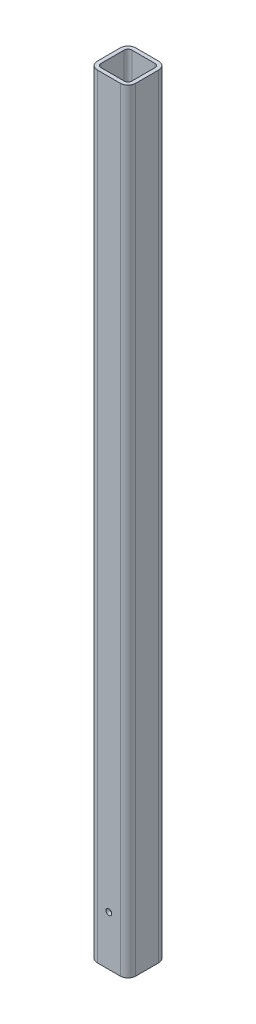
ISO-10303-21;
HEADER;
FILE_DESCRIPTION(('STEP AP214'),'2;1');
FILE_NAME('part.step','',(''),(''),'','','');
FILE_SCHEMA(('AUTOMOTIVE_DESIGN { 1 0 10303 214 1 1 1 1 }'));
ENDSEC;
DATA;
#1=APPLICATION_CONTEXT('core data for automotive mechanical design processes');
#2=APPLICATION_PROTOCOL_DEFINITION('international standard','automotive_design',2000,#1);
#3=PRODUCT_CONTEXT('',#1,'mechanical');
#4=PRODUCT('Part','Part','',(#3));
#5=PRODUCT_RELATED_PRODUCT_CATEGORY('part','',(#4));
#6=PRODUCT_DEFINITION_FORMATION('','',#4);
#7=PRODUCT_DEFINITION_CONTEXT('part definition',#1,'design');
#8=PRODUCT_DEFINITION('design','',#6,#7);
#9=PRODUCT_DEFINITION_SHAPE('','',#8);
#10=(LENGTH_UNIT() NAMED_UNIT(*) SI_UNIT(.MILLI.,.METRE.));
#11=(NAMED_UNIT(*) PLANE_ANGLE_UNIT() SI_UNIT($,.RADIAN.));
#12=(NAMED_UNIT(*) SI_UNIT($,.STERADIAN.) SOLID_ANGLE_UNIT());
#13=UNCERTAINTY_MEASURE_WITH_UNIT(LENGTH_MEASURE(1.E-05),#10,'distance_accuracy_value','');
#14=(GEOMETRIC_REPRESENTATION_CONTEXT(3) GLOBAL_UNCERTAINTY_ASSIGNED_CONTEXT((#13)) GLOBAL_UNIT_ASSIGNED_CONTEXT((#10,
#11,#12)) REPRESENTATION_CONTEXT('',''));
#15=CARTESIAN_POINT('',(0.,0.,0.));
#16=DIRECTION('',(0.,0.,1.));
#17=DIRECTION('',(1.,0.,0.));
#18=AXIS2_PLACEMENT_3D('',#15,#16,#17);
#19=CARTESIAN_POINT('',(-12.,1866.99975786051,12.));
#20=DIRECTION('',(0.,-1.,0.));
#21=DIRECTION('',(0.,0.,-1.));
#22=AXIS2_PLACEMENT_3D('',#19,#20,#21);
#23=CYLINDRICAL_SURFACE('',#22,8.);
#24=CARTESIAN_POINT('',(-12.,1060.7613706876,12.));
#25=DIRECTION('',(0.,1.,0.));
#26=DIRECTION('',(0.,0.,1.));
#27=AXIS2_PLACEMENT_3D('',#24,#25,#26);
#28=CIRCLE('',#27,8.);
#29=CARTESIAN_POINT('',(-20.,1060.7613706876,12.));
#30=VERTEX_POINT('',#29);
#31=CARTESIAN_POINT('',(-12.,1060.7613706876,20.));
#32=VERTEX_POINT('',#31);
#33=EDGE_CURVE('E234',#30,#32,#28,.T.);
#34=ORIENTED_EDGE('',*,*,#33,.T.);
#35=DIRECTION('',(0.,-1.,0.));
#36=VECTOR('',#35,1.);
#37=CARTESIAN_POINT('',(-12.,1866.99975786051,20.));
#38=LINE('',#37,#36);
#39=CARTESIAN_POINT('',(-12.,1866.99975786051,20.));
#40=VERTEX_POINT('',#39);
#41=EDGE_CURVE('E12',#40,#32,#38,.T.);
#42=ORIENTED_EDGE('',*,*,#41,.F.);
#43=CARTESIAN_POINT('',(-12.,1866.99975786051,12.));
#44=DIRECTION('',(0.,1.,0.));
#45=DIRECTION('',(0.,0.,1.));
#46=AXIS2_PLACEMENT_3D('',#43,#44,#45);
#47=CIRCLE('',#46,8.);
#48=CARTESIAN_POINT('',(-20.,1866.99975786051,12.));
#49=VERTEX_POINT('',#48);
#50=EDGE_CURVE('E313',#49,#40,#47,.T.);
#51=ORIENTED_EDGE('',*,*,#50,.F.);
#52=DIRECTION('',(0.,-1.,0.));
#53=VECTOR('',#52,1.);
#54=CARTESIAN_POINT('',(-20.,1866.99975786051,12.));
#55=LINE('',#54,#53);
#56=EDGE_CURVE('E249',#49,#30,#55,.T.);
#57=ORIENTED_EDGE('',*,*,#56,.T.);
#58=EDGE_LOOP('',(#34,#42,#51,#57));
#59=FACE_BOUND('',#58,.T.);
#60=ADVANCED_FACE('F60',(#59),#23,.T.);
#61=CARTESIAN_POINT('',(-12.,1866.99975786051,20.));
#62=DIRECTION('',(0.,0.,-1.));
#63=DIRECTION('',(-1.,0.,0.));
#64=AXIS2_PLACEMENT_3D('',#61,#62,#63);
#65=PLANE('',#64);
#66=CARTESIAN_POINT('',(0.,1112.60405955793,20.));
#67=DIRECTION('',(0.,0.,-1.));
#68=DIRECTION('',(-1.,0.,0.));
#69=AXIS2_PLACEMENT_3D('',#66,#67,#68);
#70=CIRCLE('',#69,3.);
#71=CARTESIAN_POINT('',(-3.,1112.60405955793,20.));
#72=VERTEX_POINT('',#71);
#73=EDGE_CURVE('E213',#72,#72,#70,.T.);
#74=ORIENTED_EDGE('',*,*,#73,.T.);
#75=EDGE_LOOP('',(#74));
#76=FACE_BOUND('',#75,.T.);
#77=DIRECTION('',(1.,0.,0.));
#78=VECTOR('',#77,1.);
#79=CARTESIAN_POINT('',(-12.,1060.7613706876,20.));
#80=LINE('',#79,#78);
#81=CARTESIAN_POINT('',(12.,1060.7613706876,20.));
#82=VERTEX_POINT('',#81);
#83=EDGE_CURVE('E237',#32,#82,#80,.T.);
#84=ORIENTED_EDGE('',*,*,#83,.T.);
#85=DIRECTION('',(0.,-1.,0.));
#86=VECTOR('',#85,1.);
#87=CARTESIAN_POINT('',(12.,1866.99975786051,20.));
#88=LINE('',#87,#86);
#89=CARTESIAN_POINT('',(12.,1866.99975786051,20.));
#90=VERTEX_POINT('',#89);
#91=EDGE_CURVE('E70',#90,#82,#88,.T.);
#92=ORIENTED_EDGE('',*,*,#91,.F.);
#93=DIRECTION('',(1.,0.,0.));
#94=VECTOR('',#93,1.);
#95=CARTESIAN_POINT('',(-12.,1866.99975786051,20.));
#96=LINE('',#95,#94);
#97=EDGE_CURVE('E315',#40,#90,#96,.T.);
#98=ORIENTED_EDGE('',*,*,#97,.F.);
#99=ORIENTED_EDGE('',*,*,#41,.T.);
#100=EDGE_LOOP('',(#84,#92,#98,#99));
#101=FACE_BOUND('',#100,.T.);
#102=ADVANCED_FACE('F350',(#76,#101),#65,.F.);
#103=CARTESIAN_POINT('',(12.,1866.99975786051,12.));
#104=DIRECTION('',(0.,-1.,0.));
#105=DIRECTION('',(0.,0.,-1.));
#106=AXIS2_PLACEMENT_3D('',#103,#104,#105);
#107=CYLINDRICAL_SURFACE('',#106,8.);
#108=CARTESIAN_POINT('',(12.,1060.7613706876,12.));
#109=DIRECTION('',(0.,1.,0.));
#110=DIRECTION('',(0.,0.,1.));
#111=AXIS2_PLACEMENT_3D('',#108,#109,#110);
#112=CIRCLE('',#111,8.);
#113=CARTESIAN_POINT('',(20.,1060.7613706876,12.));
#114=VERTEX_POINT('',#113);
#115=EDGE_CURVE('E239',#82,#114,#112,.T.);
#116=ORIENTED_EDGE('',*,*,#115,.T.);
#117=DIRECTION('',(0.,-1.,0.));
#118=VECTOR('',#117,1.);
#119=CARTESIAN_POINT('',(20.,1866.99975786051,12.));
#120=LINE('',#119,#118);
#121=CARTESIAN_POINT('',(20.,1866.99975786051,12.));
#122=VERTEX_POINT('',#121);
#123=EDGE_CURVE('E256',#122,#114,#120,.T.);
#124=ORIENTED_EDGE('',*,*,#123,.F.);
#125=CARTESIAN_POINT('',(12.,1866.99975786051,12.));
#126=DIRECTION('',(0.,1.,0.));
#127=DIRECTION('',(0.,0.,1.));
#128=AXIS2_PLACEMENT_3D('',#125,#126,#127);
#129=CIRCLE('',#128,8.);
#130=EDGE_CURVE('E317',#90,#122,#129,.T.);
#131=ORIENTED_EDGE('',*,*,#130,.F.);
#132=ORIENTED_EDGE('',*,*,#91,.T.);
#133=EDGE_LOOP('',(#116,#124,#131,#132));
#134=FACE_BOUND('',#133,.T.);
#135=ADVANCED_FACE('F356',(#134),#107,.T.);
#136=CARTESIAN_POINT('',(20.,1866.99975786051,-12.));
#137=DIRECTION('',(-1.,0.,0.));
#138=DIRECTION('',(0.,0.,1.));
#139=AXIS2_PLACEMENT_3D('',#136,#137,#138);
#140=PLANE('',#139);
#141=DIRECTION('',(0.,0.,-1.));
#142=VECTOR('',#141,1.);
#143=CARTESIAN_POINT('',(20.,1060.7613706876,-12.));
#144=LINE('',#143,#142);
#145=CARTESIAN_POINT('',(20.,1060.7613706876,-12.));
#146=VERTEX_POINT('',#145);
#147=EDGE_CURVE('E241',#114,#146,#144,.T.);
#148=ORIENTED_EDGE('',*,*,#147,.T.);
#149=DIRECTION('',(0.,-1.,0.));
#150=VECTOR('',#149,1.);
#151=CARTESIAN_POINT('',(20.,1866.99975786051,-12.));
#152=LINE('',#151,#150);
#153=CARTESIAN_POINT('',(20.,1866.99975786051,-12.));
#154=VERTEX_POINT('',#153);
#155=EDGE_CURVE('E253',#154,#146,#152,.T.);
#156=ORIENTED_EDGE('',*,*,#155,.F.);
#157=DIRECTION('',(0.,0.,-1.));
#158=VECTOR('',#157,1.);
#159=CARTESIAN_POINT('',(20.,1866.99975786051,-12.));
#160=LINE('',#159,#158);
#161=EDGE_CURVE('E319',#122,#154,#160,.T.);
#162=ORIENTED_EDGE('',*,*,#161,.F.);
#163=ORIENTED_EDGE('',*,*,#123,.T.);
#164=EDGE_LOOP('',(#148,#156,#162,#163));
#165=FACE_BOUND('',#164,.T.);
#166=ADVANCED_FACE('F325',(#165),#140,.F.);
#167=CARTESIAN_POINT('',(12.,1866.99975786051,-12.));
#168=DIRECTION('',(0.,-1.,0.));
#169=DIRECTION('',(0.,0.,-1.));
#170=AXIS2_PLACEMENT_3D('',#167,#168,#169);
#171=CYLINDRICAL_SURFACE('',#170,8.);
#172=CARTESIAN_POINT('',(12.,1060.7613706876,-12.));
#173=DIRECTION('',(0.,1.,0.));
#174=DIRECTION('',(0.,0.,1.));
#175=AXIS2_PLACEMENT_3D('',#172,#173,#174);
#176=CIRCLE('',#175,8.);
#177=CARTESIAN_POINT('',(12.,1060.7613706876,-20.));
#178=VERTEX_POINT('',#177);
#179=EDGE_CURVE('E243',#146,#178,#176,.T.);
#180=ORIENTED_EDGE('',*,*,#179,.T.);
#181=DIRECTION('',(0.,-1.,0.));
#182=VECTOR('',#181,1.);
#183=CARTESIAN_POINT('',(12.,1866.99975786051,-20.));
#184=LINE('',#183,#182);
#185=CARTESIAN_POINT('',(12.,1866.99975786051,-20.));
#186=VERTEX_POINT('',#185);
#187=EDGE_CURVE('E200',#186,#178,#184,.T.);
#188=ORIENTED_EDGE('',*,*,#187,.F.);
#189=CARTESIAN_POINT('',(12.,1866.99975786051,-12.));
#190=DIRECTION('',(0.,1.,0.));
#191=DIRECTION('',(0.,0.,1.));
#192=AXIS2_PLACEMENT_3D('',#189,#190,#191);
#193=CIRCLE('',#192,8.);
#194=EDGE_CURVE('E191',#154,#186,#193,.T.);
#195=ORIENTED_EDGE('',*,*,#194,.F.);
#196=ORIENTED_EDGE('',*,*,#155,.T.);
#197=EDGE_LOOP('',(#180,#188,#195,#196));
#198=FACE_BOUND('',#197,.T.);
#199=ADVANCED_FACE('F329',(#198),#171,.T.);
#200=CARTESIAN_POINT('',(12.,1866.99975786051,-20.));
#201=DIRECTION('',(0.,0.,1.));
#202=DIRECTION('',(1.,0.,0.));
#203=AXIS2_PLACEMENT_3D('',#200,#201,#202);
#204=PLANE('',#203);
#205=CARTESIAN_POINT('',(0.,1112.60405955793,-20.));
#206=DIRECTION('',(0.,0.,-1.));
#207=DIRECTION('',(-1.,0.,0.));
#208=AXIS2_PLACEMENT_3D('',#205,#206,#207);
#209=CIRCLE('',#208,3.);
#210=CARTESIAN_POINT('',(-3.,1112.60405955793,-20.));
#211=VERTEX_POINT('',#210);
#212=EDGE_CURVE('E390',#211,#211,#209,.T.);
#213=ORIENTED_EDGE('',*,*,#212,.F.);
#214=EDGE_LOOP('',(#213));
#215=FACE_BOUND('',#214,.T.);
#216=DIRECTION('',(-1.,0.,0.));
#217=VECTOR('',#216,1.);
#218=CARTESIAN_POINT('',(12.,1060.7613706876,-20.));
#219=LINE('',#218,#217);
#220=CARTESIAN_POINT('',(-12.,1060.7613706876,-20.));
#221=VERTEX_POINT('',#220);
#222=EDGE_CURVE('E199',#178,#221,#219,.T.);
#223=ORIENTED_EDGE('',*,*,#222,.T.);
#224=DIRECTION('',(0.,-1.,0.));
#225=VECTOR('',#224,1.);
#226=CARTESIAN_POINT('',(-12.,1866.99975786051,-20.));
#227=LINE('',#226,#225);
#228=CARTESIAN_POINT('',(-12.,1866.99975786051,-20.));
#229=VERTEX_POINT('',#228);
#230=EDGE_CURVE('E196',#229,#221,#227,.T.);
#231=ORIENTED_EDGE('',*,*,#230,.F.);
#232=DIRECTION('',(-1.,0.,0.));
#233=VECTOR('',#232,1.);
#234=CARTESIAN_POINT('',(12.,1866.99975786051,-20.));
#235=LINE('',#234,#233);
#236=EDGE_CURVE('E185',#186,#229,#235,.T.);
#237=ORIENTED_EDGE('',*,*,#236,.F.);
#238=ORIENTED_EDGE('',*,*,#187,.T.);
#239=EDGE_LOOP('',(#223,#231,#237,#238));
#240=FACE_BOUND('',#239,.T.);
#241=ADVANCED_FACE('F197',(#215,#240),#204,.F.);
#242=CARTESIAN_POINT('',(-12.,1866.99975786051,-12.));
#243=DIRECTION('',(0.,-1.,0.));
#244=DIRECTION('',(0.,0.,-1.));
#245=AXIS2_PLACEMENT_3D('',#242,#243,#244);
#246=CYLINDRICAL_SURFACE('',#245,8.);
#247=CARTESIAN_POINT('',(-12.,1060.7613706876,-12.));
#248=DIRECTION('',(0.,1.,0.));
#249=DIRECTION('',(0.,0.,1.));
#250=AXIS2_PLACEMENT_3D('',#247,#248,#249);
#251=CIRCLE('',#250,8.);
#252=CARTESIAN_POINT('',(-20.,1060.7613706876,-12.));
#253=VERTEX_POINT('',#252);
#254=EDGE_CURVE('E132',#221,#253,#251,.T.);
#255=ORIENTED_EDGE('',*,*,#254,.T.);
#256=DIRECTION('',(0.,-1.,0.));
#257=VECTOR('',#256,1.);
#258=CARTESIAN_POINT('',(-20.,1866.99975786051,-12.));
#259=LINE('',#258,#257);
#260=CARTESIAN_POINT('',(-20.,1866.99975786051,-12.));
#261=VERTEX_POINT('',#260);
#262=EDGE_CURVE('E201',#261,#253,#259,.T.);
#263=ORIENTED_EDGE('',*,*,#262,.F.);
#264=CARTESIAN_POINT('',(-12.,1866.99975786051,-12.));
#265=DIRECTION('',(0.,1.,0.));
#266=DIRECTION('',(0.,0.,1.));
#267=AXIS2_PLACEMENT_3D('',#264,#265,#266);
#268=CIRCLE('',#267,8.);
#269=EDGE_CURVE('E189',#229,#261,#268,.T.);
#270=ORIENTED_EDGE('',*,*,#269,.F.);
#271=ORIENTED_EDGE('',*,*,#230,.T.);
#272=EDGE_LOOP('',(#255,#263,#270,#271));
#273=FACE_BOUND('',#272,.T.);
#274=ADVANCED_FACE('F203',(#273),#246,.T.);
#275=CARTESIAN_POINT('',(12.,1866.99975786051,12.));
#276=DIRECTION('',(0.,-1.,0.));
#277=DIRECTION('',(0.,0.,-1.));
#278=AXIS2_PLACEMENT_3D('',#275,#276,#277);
#279=CYLINDRICAL_SURFACE('',#278,4.);
#280=CARTESIAN_POINT('',(12.,1060.7613706876,12.));
#281=DIRECTION('',(0.,1.,0.));
#282=DIRECTION('',(0.,0.,1.));
#283=AXIS2_PLACEMENT_3D('',#280,#281,#282);
#284=CIRCLE('',#283,4.);
#285=CARTESIAN_POINT('',(12.,1060.7613706876,16.));
#286=VERTEX_POINT('',#285);
#287=CARTESIAN_POINT('',(16.,1060.7613706876,12.));
#288=VERTEX_POINT('',#287);
#289=EDGE_CURVE('E209',#286,#288,#284,.T.);
#290=ORIENTED_EDGE('',*,*,#289,.F.);
#291=DIRECTION('',(0.,-1.,0.));
#292=VECTOR('',#291,1.);
#293=CARTESIAN_POINT('',(12.,1866.99975786051,16.));
#294=LINE('',#293,#292);
#295=CARTESIAN_POINT('',(12.,1866.99975786051,16.));
#296=VERTEX_POINT('',#295);
#297=EDGE_CURVE('E146',#296,#286,#294,.T.);
#298=ORIENTED_EDGE('',*,*,#297,.F.);
#299=CARTESIAN_POINT('',(12.,1866.99975786051,12.));
#300=DIRECTION('',(0.,1.,0.));
#301=DIRECTION('',(0.,0.,1.));
#302=AXIS2_PLACEMENT_3D('',#299,#300,#301);
#303=CIRCLE('',#302,4.);
#304=CARTESIAN_POINT('',(16.,1866.99975786051,12.));
#305=VERTEX_POINT('',#304);
#306=EDGE_CURVE('E248',#296,#305,#303,.T.);
#307=ORIENTED_EDGE('',*,*,#306,.T.);
#308=DIRECTION('',(0.,-1.,0.));
#309=VECTOR('',#308,1.);
#310=CARTESIAN_POINT('',(16.,1866.99975786051,12.));
#311=LINE('',#310,#309);
#312=EDGE_CURVE('E205',#305,#288,#311,.T.);
#313=ORIENTED_EDGE('',*,*,#312,.T.);
#314=EDGE_LOOP('',(#290,#298,#307,#313));
#315=FACE_BOUND('',#314,.T.);
#316=ADVANCED_FACE('F62',(#315),#279,.F.);
#317=CARTESIAN_POINT('',(-12.,1866.99975786051,16.));
#318=DIRECTION('',(0.,0.,-1.));
#319=DIRECTION('',(-1.,0.,0.));
#320=AXIS2_PLACEMENT_3D('',#317,#318,#319);
#321=PLANE('',#320);
#322=CARTESIAN_POINT('',(0.,1112.60405955793,16.));
#323=DIRECTION('',(0.,0.,-1.));
#324=DIRECTION('',(-1.,0.,0.));
#325=AXIS2_PLACEMENT_3D('',#322,#323,#324);
#326=CIRCLE('',#325,3.);
#327=CARTESIAN_POINT('',(-3.,1112.60405955793,16.));
#328=VERTEX_POINT('',#327);
#329=EDGE_CURVE('E385',#328,#328,#326,.T.);
#330=ORIENTED_EDGE('',*,*,#329,.F.);
#331=EDGE_LOOP('',(#330));
#332=FACE_BOUND('',#331,.T.);
#333=DIRECTION('',(1.,0.,0.));
#334=VECTOR('',#333,1.);
#335=CARTESIAN_POINT('',(-12.,1060.7613706876,16.));
#336=LINE('',#335,#334);
#337=CARTESIAN_POINT('',(-12.,1060.7613706876,16.));
#338=VERTEX_POINT('',#337);
#339=EDGE_CURVE('E212',#338,#286,#336,.T.);
#340=ORIENTED_EDGE('',*,*,#339,.F.);
#341=DIRECTION('',(0.,-1.,0.));
#342=VECTOR('',#341,1.);
#343=CARTESIAN_POINT('',(-12.,1866.99975786051,16.));
#344=LINE('',#343,#342);
#345=CARTESIAN_POINT('',(-12.,1866.99975786051,16.));
#346=VERTEX_POINT('',#345);
#347=EDGE_CURVE('E272',#346,#338,#344,.T.);
#348=ORIENTED_EDGE('',*,*,#347,.F.);
#349=DIRECTION('',(1.,0.,0.));
#350=VECTOR('',#349,1.);
#351=CARTESIAN_POINT('',(-12.,1866.99975786051,16.));
#352=LINE('',#351,#350);
#353=EDGE_CURVE('E278',#346,#296,#352,.T.);
#354=ORIENTED_EDGE('',*,*,#353,.T.);
#355=ORIENTED_EDGE('',*,*,#297,.T.);
#356=EDGE_LOOP('',(#340,#348,#354,#355));
#357=FACE_BOUND('',#356,.T.);
#358=ADVANCED_FACE('F276',(#332,#357),#321,.T.);
#359=CARTESIAN_POINT('',(-12.,1866.99975786051,12.));
#360=DIRECTION('',(0.,-1.,0.));
#361=DIRECTION('',(0.,0.,-1.));
#362=AXIS2_PLACEMENT_3D('',#359,#360,#361);
#363=CYLINDRICAL_SURFACE('',#362,4.);
#364=CARTESIAN_POINT('',(-12.,1060.7613706876,12.));
#365=DIRECTION('',(0.,1.,0.));
#366=DIRECTION('',(0.,0.,1.));
#367=AXIS2_PLACEMENT_3D('',#364,#365,#366);
#368=CIRCLE('',#367,4.);
#369=CARTESIAN_POINT('',(-16.,1060.7613706876,12.));
#370=VERTEX_POINT('',#369);
#371=EDGE_CURVE('E216',#370,#338,#368,.T.);
#372=ORIENTED_EDGE('',*,*,#371,.F.);
#373=DIRECTION('',(0.,-1.,0.));
#374=VECTOR('',#373,1.);
#375=CARTESIAN_POINT('',(-16.,1866.99975786051,12.));
#376=LINE('',#375,#374);
#377=CARTESIAN_POINT('',(-16.,1866.99975786051,12.));
#378=VERTEX_POINT('',#377);
#379=EDGE_CURVE('E270',#378,#370,#376,.T.);
#380=ORIENTED_EDGE('',*,*,#379,.F.);
#381=CARTESIAN_POINT('',(-12.,1866.99975786051,12.));
#382=DIRECTION('',(0.,1.,0.));
#383=DIRECTION('',(0.,0.,1.));
#384=AXIS2_PLACEMENT_3D('',#381,#382,#383);
#385=CIRCLE('',#384,4.);
#386=EDGE_CURVE('E289',#378,#346,#385,.T.);
#387=ORIENTED_EDGE('',*,*,#386,.T.);
#388=ORIENTED_EDGE('',*,*,#347,.T.);
#389=EDGE_LOOP('',(#372,#380,#387,#388));
#390=FACE_BOUND('',#389,.T.);
#391=ADVANCED_FACE('F286',(#390),#363,.F.);
#392=CARTESIAN_POINT('',(-16.,1866.99975786051,12.));
#393=DIRECTION('',(1.,0.,0.));
#394=DIRECTION('',(0.,0.,-1.));
#395=AXIS2_PLACEMENT_3D('',#392,#393,#394);
#396=PLANE('',#395);
#397=DIRECTION('',(0.,0.,1.));
#398=VECTOR('',#397,1.);
#399=CARTESIAN_POINT('',(-16.,1060.7613706876,12.));
#400=LINE('',#399,#398);
#401=CARTESIAN_POINT('',(-16.,1060.7613706876,-12.));
#402=VERTEX_POINT('',#401);
#403=EDGE_CURVE('E219',#402,#370,#400,.T.);
#404=ORIENTED_EDGE('',*,*,#403,.F.);
#405=DIRECTION('',(0.,-1.,0.));
#406=VECTOR('',#405,1.);
#407=CARTESIAN_POINT('',(-16.,1866.99975786051,-12.));
#408=LINE('',#407,#406);
#409=CARTESIAN_POINT('',(-16.,1866.99975786051,-12.));
#410=VERTEX_POINT('',#409);
#411=EDGE_CURVE('E268',#410,#402,#408,.T.);
#412=ORIENTED_EDGE('',*,*,#411,.F.);
#413=DIRECTION('',(0.,0.,1.));
#414=VECTOR('',#413,1.);
#415=CARTESIAN_POINT('',(-16.,1866.99975786051,12.));
#416=LINE('',#415,#414);
#417=EDGE_CURVE('E295',#410,#378,#416,.T.);
#418=ORIENTED_EDGE('',*,*,#417,.T.);
#419=ORIENTED_EDGE('',*,*,#379,.T.);
#420=EDGE_LOOP('',(#404,#412,#418,#419));
#421=FACE_BOUND('',#420,.T.);
#422=ADVANCED_FACE('F371',(#421),#396,.T.);
#423=CARTESIAN_POINT('',(-12.,1866.99975786051,-12.));
#424=DIRECTION('',(0.,-1.,0.));
#425=DIRECTION('',(0.,0.,-1.));
#426=AXIS2_PLACEMENT_3D('',#423,#424,#425);
#427=CYLINDRICAL_SURFACE('',#426,4.);
#428=CARTESIAN_POINT('',(-12.,1060.7613706876,-12.));
#429=DIRECTION('',(0.,1.,0.));
#430=DIRECTION('',(0.,0.,1.));
#431=AXIS2_PLACEMENT_3D('',#428,#429,#430);
#432=CIRCLE('',#431,4.);
#433=CARTESIAN_POINT('',(-12.,1060.7613706876,-16.));
#434=VERTEX_POINT('',#433);
#435=EDGE_CURVE('E222',#434,#402,#432,.T.);
#436=ORIENTED_EDGE('',*,*,#435,.F.);
#437=DIRECTION('',(0.,-1.,0.));
#438=VECTOR('',#437,1.);
#439=CARTESIAN_POINT('',(-12.,1866.99975786051,-16.));
#440=LINE('',#439,#438);
#441=CARTESIAN_POINT('',(-12.,1866.99975786051,-16.));
#442=VERTEX_POINT('',#441);
#443=EDGE_CURVE('E266',#442,#434,#440,.T.);
#444=ORIENTED_EDGE('',*,*,#443,.F.);
#445=CARTESIAN_POINT('',(-12.,1866.99975786051,-12.));
#446=DIRECTION('',(0.,1.,0.));
#447=DIRECTION('',(0.,0.,1.));
#448=AXIS2_PLACEMENT_3D('',#445,#446,#447);
#449=CIRCLE('',#448,4.);
#450=EDGE_CURVE('E301',#442,#410,#449,.T.);
#451=ORIENTED_EDGE('',*,*,#450,.T.);
#452=ORIENTED_EDGE('',*,*,#411,.T.);
#453=EDGE_LOOP('',(#436,#444,#451,#452));
#454=FACE_BOUND('',#453,.T.);
#455=ADVANCED_FACE('F367',(#454),#427,.F.);
#456=CARTESIAN_POINT('',(12.,1866.99975786051,-16.));
#457=DIRECTION('',(0.,0.,1.));
#458=DIRECTION('',(1.,0.,0.));
#459=AXIS2_PLACEMENT_3D('',#456,#457,#458);
#460=PLANE('',#459);
#461=CARTESIAN_POINT('',(0.,1112.60405955793,-16.));
#462=DIRECTION('',(0.,0.,1.));
#463=DIRECTION('',(1.,0.,0.));
#464=AXIS2_PLACEMENT_3D('',#461,#462,#463);
#465=CIRCLE('',#464,3.);
#466=CARTESIAN_POINT('',(3.,1112.60405955793,-16.));
#467=VERTEX_POINT('',#466);
#468=EDGE_CURVE('E64',#467,#467,#465,.T.);
#469=ORIENTED_EDGE('',*,*,#468,.F.);
#470=EDGE_LOOP('',(#469));
#471=FACE_BOUND('',#470,.T.);
#472=DIRECTION('',(-1.,0.,0.));
#473=VECTOR('',#472,1.);
#474=CARTESIAN_POINT('',(12.,1060.7613706876,-16.));
#475=LINE('',#474,#473);
#476=CARTESIAN_POINT('',(12.,1060.7613706876,-16.));
#477=VERTEX_POINT('',#476);
#478=EDGE_CURVE('E225',#477,#434,#475,.T.);
#479=ORIENTED_EDGE('',*,*,#478,.F.);
#480=DIRECTION('',(0.,-1.,0.));
#481=VECTOR('',#480,1.);
#482=CARTESIAN_POINT('',(12.,1866.99975786051,-16.));
#483=LINE('',#482,#481);
#484=CARTESIAN_POINT('',(12.,1866.99975786051,-16.));
#485=VERTEX_POINT('',#484);
#486=EDGE_CURVE('E264',#485,#477,#483,.T.);
#487=ORIENTED_EDGE('',*,*,#486,.F.);
#488=DIRECTION('',(-1.,0.,0.));
#489=VECTOR('',#488,1.);
#490=CARTESIAN_POINT('',(12.,1866.99975786051,-16.));
#491=LINE('',#490,#489);
#492=EDGE_CURVE('E304',#485,#442,#491,.T.);
#493=ORIENTED_EDGE('',*,*,#492,.T.);
#494=ORIENTED_EDGE('',*,*,#443,.T.);
#495=EDGE_LOOP('',(#479,#487,#493,#494));
#496=FACE_BOUND('',#495,.T.);
#497=ADVANCED_FACE('F363',(#471,#496),#460,.T.);
#498=CARTESIAN_POINT('',(12.,1866.99975786051,-12.));
#499=DIRECTION('',(0.,-1.,0.));
#500=DIRECTION('',(0.,0.,-1.));
#501=AXIS2_PLACEMENT_3D('',#498,#499,#500);
#502=CYLINDRICAL_SURFACE('',#501,4.);
#503=CARTESIAN_POINT('',(12.,1060.7613706876,-12.));
#504=DIRECTION('',(0.,1.,0.));
#505=DIRECTION('',(0.,0.,1.));
#506=AXIS2_PLACEMENT_3D('',#503,#504,#505);
#507=CIRCLE('',#506,4.);
#508=CARTESIAN_POINT('',(16.,1060.7613706876,-12.));
#509=VERTEX_POINT('',#508);
#510=EDGE_CURVE('E228',#509,#477,#507,.T.);
#511=ORIENTED_EDGE('',*,*,#510,.F.);
#512=DIRECTION('',(0.,-1.,0.));
#513=VECTOR('',#512,1.);
#514=CARTESIAN_POINT('',(16.,1866.99975786051,-12.));
#515=LINE('',#514,#513);
#516=CARTESIAN_POINT('',(16.,1866.99975786051,-12.));
#517=VERTEX_POINT('',#516);
#518=EDGE_CURVE('E262',#517,#509,#515,.T.);
#519=ORIENTED_EDGE('',*,*,#518,.F.);
#520=CARTESIAN_POINT('',(12.,1866.99975786051,-12.));
#521=DIRECTION('',(0.,1.,0.));
#522=DIRECTION('',(0.,0.,1.));
#523=AXIS2_PLACEMENT_3D('',#520,#521,#522);
#524=CIRCLE('',#523,4.);
#525=EDGE_CURVE('E307',#517,#485,#524,.T.);
#526=ORIENTED_EDGE('',*,*,#525,.T.);
#527=ORIENTED_EDGE('',*,*,#486,.T.);
#528=EDGE_LOOP('',(#511,#519,#526,#527));
#529=FACE_BOUND('',#528,.T.);
#530=ADVANCED_FACE('F344',(#529),#502,.F.);
#531=CARTESIAN_POINT('',(16.,1866.99975786051,-12.));
#532=DIRECTION('',(-1.,0.,0.));
#533=DIRECTION('',(0.,0.,1.));
#534=AXIS2_PLACEMENT_3D('',#531,#532,#533);
#535=PLANE('',#534);
#536=DIRECTION('',(0.,0.,-1.));
#537=VECTOR('',#536,1.);
#538=CARTESIAN_POINT('',(16.,1060.7613706876,-12.));
#539=LINE('',#538,#537);
#540=EDGE_CURVE('E231',#288,#509,#539,.T.);
#541=ORIENTED_EDGE('',*,*,#540,.F.);
#542=ORIENTED_EDGE('',*,*,#312,.F.);
#543=DIRECTION('',(0.,0.,-1.));
#544=VECTOR('',#543,1.);
#545=CARTESIAN_POINT('',(16.,1866.99975786051,-12.));
#546=LINE('',#545,#544);
#547=EDGE_CURVE('E310',#305,#517,#546,.T.);
#548=ORIENTED_EDGE('',*,*,#547,.T.);
#549=ORIENTED_EDGE('',*,*,#518,.T.);
#550=EDGE_LOOP('',(#541,#542,#548,#549));
#551=FACE_BOUND('',#550,.T.);
#552=ADVANCED_FACE('F337',(#551),#535,.T.);
#553=CARTESIAN_POINT('',(-20.,1866.99975786051,12.));
#554=DIRECTION('',(1.,0.,0.));
#555=DIRECTION('',(0.,0.,-1.));
#556=AXIS2_PLACEMENT_3D('',#553,#554,#555);
#557=PLANE('',#556);
#558=DIRECTION('',(0.,0.,1.));
#559=VECTOR('',#558,1.);
#560=CARTESIAN_POINT('',(-20.,1060.7613706876,12.));
#561=LINE('',#560,#559);
#562=EDGE_CURVE('E138',#253,#30,#561,.T.);
#563=ORIENTED_EDGE('',*,*,#562,.T.);
#564=ORIENTED_EDGE('',*,*,#56,.F.);
#565=DIRECTION('',(0.,0.,1.));
#566=VECTOR('',#565,1.);
#567=CARTESIAN_POINT('',(-20.,1866.99975786051,12.));
#568=LINE('',#567,#566);
#569=EDGE_CURVE('E79',#261,#49,#568,.T.);
#570=ORIENTED_EDGE('',*,*,#569,.F.);
#571=ORIENTED_EDGE('',*,*,#262,.T.);
#572=EDGE_LOOP('',(#563,#564,#570,#571));
#573=FACE_BOUND('',#572,.T.);
#574=ADVANCED_FACE('F335',(#573),#557,.F.);
#575=CARTESIAN_POINT('',(-12.,1866.99975786051,12.));
#576=DIRECTION('',(0.,1.,0.));
#577=DIRECTION('',(0.,0.,1.));
#578=AXIS2_PLACEMENT_3D('',#575,#576,#577);
#579=PLANE('',#578);
#580=ORIENTED_EDGE('',*,*,#306,.F.);
#581=ORIENTED_EDGE('',*,*,#353,.F.);
#582=ORIENTED_EDGE('',*,*,#386,.F.);
#583=ORIENTED_EDGE('',*,*,#417,.F.);
#584=ORIENTED_EDGE('',*,*,#450,.F.);
#585=ORIENTED_EDGE('',*,*,#492,.F.);
#586=ORIENTED_EDGE('',*,*,#525,.F.);
#587=ORIENTED_EDGE('',*,*,#547,.F.);
#588=EDGE_LOOP('',(#580,#581,#582,#583,#584,#585,#586,#587));
#589=FACE_BOUND('',#588,.T.);
#590=ORIENTED_EDGE('',*,*,#50,.T.);
#591=ORIENTED_EDGE('',*,*,#97,.T.);
#592=ORIENTED_EDGE('',*,*,#130,.T.);
#593=ORIENTED_EDGE('',*,*,#161,.T.);
#594=ORIENTED_EDGE('',*,*,#194,.T.);
#595=ORIENTED_EDGE('',*,*,#236,.T.);
#596=ORIENTED_EDGE('',*,*,#269,.T.);
#597=ORIENTED_EDGE('',*,*,#569,.T.);
#598=EDGE_LOOP('',(#590,#591,#592,#593,#594,#595,#596,#597));
#599=FACE_BOUND('',#598,.T.);
#600=ADVANCED_FACE('F187',(#589,#599),#579,.T.);
#601=CARTESIAN_POINT('',(-12.,1060.7613706876,12.));
#602=DIRECTION('',(0.,1.,0.));
#603=DIRECTION('',(0.,0.,1.));
#604=AXIS2_PLACEMENT_3D('',#601,#602,#603);
#605=PLANE('',#604);
#606=ORIENTED_EDGE('',*,*,#289,.T.);
#607=ORIENTED_EDGE('',*,*,#540,.T.);
#608=ORIENTED_EDGE('',*,*,#510,.T.);
#609=ORIENTED_EDGE('',*,*,#478,.T.);
#610=ORIENTED_EDGE('',*,*,#435,.T.);
#611=ORIENTED_EDGE('',*,*,#403,.T.);
#612=ORIENTED_EDGE('',*,*,#371,.T.);
#613=ORIENTED_EDGE('',*,*,#339,.T.);
#614=EDGE_LOOP('',(#606,#607,#608,#609,#610,#611,#612,#613));
#615=FACE_BOUND('',#614,.T.);
#616=ORIENTED_EDGE('',*,*,#33,.F.);
#617=ORIENTED_EDGE('',*,*,#562,.F.);
#618=ORIENTED_EDGE('',*,*,#254,.F.);
#619=ORIENTED_EDGE('',*,*,#222,.F.);
#620=ORIENTED_EDGE('',*,*,#179,.F.);
#621=ORIENTED_EDGE('',*,*,#147,.F.);
#622=ORIENTED_EDGE('',*,*,#115,.F.);
#623=ORIENTED_EDGE('',*,*,#83,.F.);
#624=EDGE_LOOP('',(#616,#617,#618,#619,#620,#621,#622,#623));
#625=FACE_BOUND('',#624,.T.);
#626=ADVANCED_FACE('F281',(#615,#625),#605,.F.);
#627=CARTESIAN_POINT('',(0.,1112.60405955793,56.));
#628=DIRECTION('',(0.,0.,-1.));
#629=DIRECTION('',(-1.,0.,0.));
#630=AXIS2_PLACEMENT_3D('',#627,#628,#629);
#631=CYLINDRICAL_SURFACE('',#630,3.);
#632=ORIENTED_EDGE('',*,*,#468,.T.);
#633=EDGE_LOOP('',(#632));
#634=FACE_BOUND('',#633,.T.);
#635=ORIENTED_EDGE('',*,*,#212,.T.);
#636=EDGE_LOOP('',(#635));
#637=FACE_BOUND('',#636,.T.);
#638=ADVANCED_FACE('F395',(#634,#637),#631,.F.);
#639=ORIENTED_EDGE('',*,*,#329,.T.);
#640=EDGE_LOOP('',(#639));
#641=FACE_BOUND('',#640,.T.);
#642=ORIENTED_EDGE('',*,*,#73,.F.);
#643=EDGE_LOOP('',(#642));
#644=FACE_BOUND('',#643,.T.);
#645=ADVANCED_FACE('F497',(#641,#644),#631,.F.);
#646=CLOSED_SHELL('',(#60,#102,#135,#166,#199,#241,#274,#316,#358,#391,#422,#455,#497,#530,#552,
#574,#600,#626,#638,#645));
#647=MANIFOLD_SOLID_BREP('B2',#646);
#648=ADVANCED_BREP_SHAPE_REPRESENTATION('',(#18,#647),#14);
#649=SHAPE_DEFINITION_REPRESENTATION(#9,#648);
ENDSEC;
END-ISO-10303-21;
